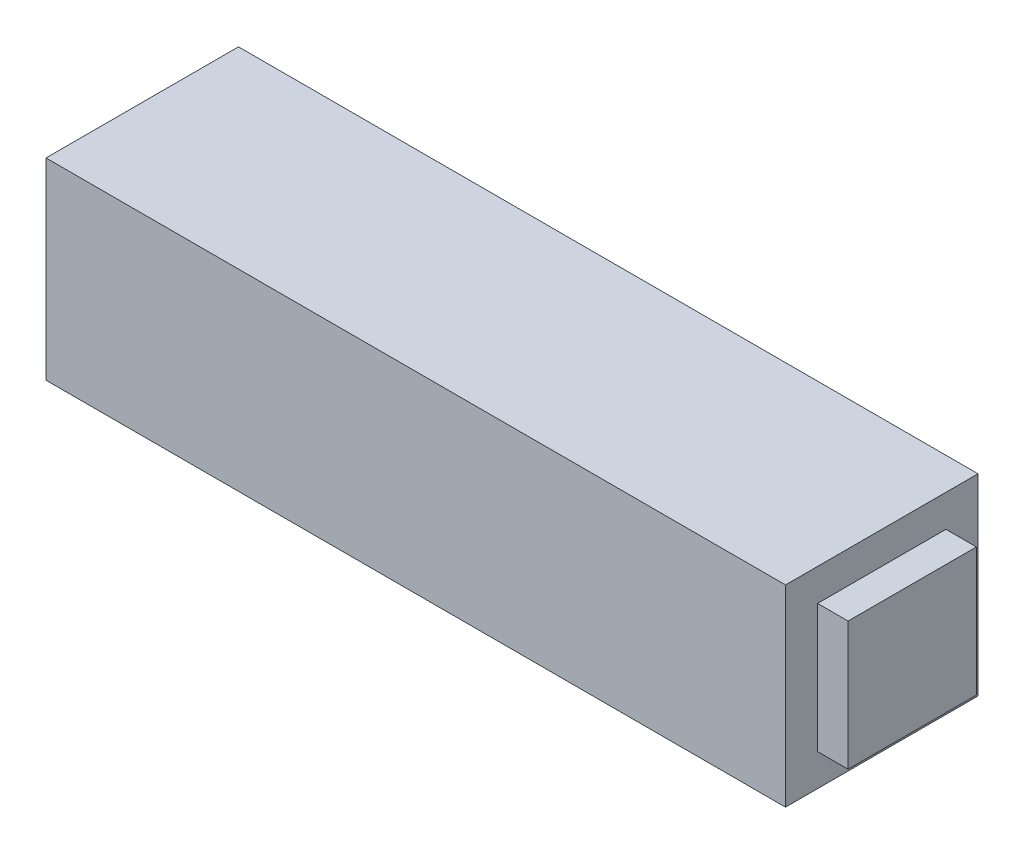
ISO-10303-21;
HEADER;
FILE_DESCRIPTION(('STEP AP214'),'2;1');
FILE_NAME('part.step','',(''),(''),'','','');
FILE_SCHEMA(('AUTOMOTIVE_DESIGN { 1 0 10303 214 1 1 1 1 }'));
ENDSEC;
DATA;
#1=APPLICATION_CONTEXT('core data for automotive mechanical design processes');
#2=APPLICATION_PROTOCOL_DEFINITION('international standard','automotive_design',2000,#1);
#3=PRODUCT_CONTEXT('',#1,'mechanical');
#4=PRODUCT('Part','Part','',(#3));
#5=PRODUCT_RELATED_PRODUCT_CATEGORY('part','',(#4));
#6=PRODUCT_DEFINITION_FORMATION('','',#4);
#7=PRODUCT_DEFINITION_CONTEXT('part definition',#1,'design');
#8=PRODUCT_DEFINITION('design','',#6,#7);
#9=PRODUCT_DEFINITION_SHAPE('','',#8);
#10=(LENGTH_UNIT() NAMED_UNIT(*) SI_UNIT(.MILLI.,.METRE.));
#11=(NAMED_UNIT(*) PLANE_ANGLE_UNIT() SI_UNIT($,.RADIAN.));
#12=(NAMED_UNIT(*) SI_UNIT($,.STERADIAN.) SOLID_ANGLE_UNIT());
#13=UNCERTAINTY_MEASURE_WITH_UNIT(LENGTH_MEASURE(1.E-05),#10,'distance_accuracy_value','');
#14=(GEOMETRIC_REPRESENTATION_CONTEXT(3) GLOBAL_UNCERTAINTY_ASSIGNED_CONTEXT((#13)) GLOBAL_UNIT_ASSIGNED_CONTEXT((#10,
#11,#12)) REPRESENTATION_CONTEXT('',''));
#15=CARTESIAN_POINT('',(0.,0.,0.));
#16=DIRECTION('',(0.,0.,1.));
#17=DIRECTION('',(1.,0.,0.));
#18=AXIS2_PLACEMENT_3D('',#15,#16,#17);
#19=CARTESIAN_POINT('',(57.625,-18.0775862068965,15.));
#20=DIRECTION('',(-1.,0.,0.));
#21=DIRECTION('',(0.,0.,1.));
#22=AXIS2_PLACEMENT_3D('',#19,#20,#21);
#23=PLANE('',#22);
#24=DIRECTION('',(0.,1.,0.));
#25=VECTOR('',#24,1.);
#26=CARTESIAN_POINT('',(57.625,-18.0775862068965,-15.));
#27=LINE('',#26,#25);
#28=CARTESIAN_POINT('',(57.625,-18.0775862068965,-15.));
#29=VERTEX_POINT('',#28);
#30=CARTESIAN_POINT('',(57.625,11.9224137931034,-15.));
#31=VERTEX_POINT('',#30);
#32=EDGE_CURVE('E203',#29,#31,#27,.T.);
#33=ORIENTED_EDGE('',*,*,#32,.T.);
#34=DIRECTION('',(0.,0.,-1.));
#35=VECTOR('',#34,1.);
#36=CARTESIAN_POINT('',(57.625,11.9224137931034,15.));
#37=LINE('',#36,#35);
#38=CARTESIAN_POINT('',(57.625,11.9224137931034,15.));
#39=VERTEX_POINT('',#38);
#40=EDGE_CURVE('E206',#39,#31,#37,.T.);
#41=ORIENTED_EDGE('',*,*,#40,.F.);
#42=DIRECTION('',(0.,1.,0.));
#43=VECTOR('',#42,1.);
#44=CARTESIAN_POINT('',(57.625,-18.0775862068965,15.));
#45=LINE('',#44,#43);
#46=CARTESIAN_POINT('',(57.625,-18.0775862068965,15.));
#47=VERTEX_POINT('',#46);
#48=EDGE_CURVE('E195',#47,#39,#45,.T.);
#49=ORIENTED_EDGE('',*,*,#48,.F.);
#50=DIRECTION('',(0.,0.,-1.));
#51=VECTOR('',#50,1.);
#52=CARTESIAN_POINT('',(57.625,-18.0775862068965,15.));
#53=LINE('',#52,#51);
#54=EDGE_CURVE('E50',#47,#29,#53,.T.);
#55=ORIENTED_EDGE('',*,*,#54,.T.);
#56=EDGE_LOOP('',(#33,#41,#49,#55));
#57=FACE_BOUND('',#56,.T.);
#58=DIRECTION('',(0.,-1.,0.));
#59=VECTOR('',#58,1.);
#60=CARTESIAN_POINT('',(57.625,-13.0775862068965,10.));
#61=LINE('',#60,#59);
#62=CARTESIAN_POINT('',(57.625,6.92241379310345,10.));
#63=VERTEX_POINT('',#62);
#64=CARTESIAN_POINT('',(57.625,-13.0775862068965,10.));
#65=VERTEX_POINT('',#64);
#66=EDGE_CURVE('E53',#63,#65,#61,.T.);
#67=ORIENTED_EDGE('',*,*,#66,.F.);
#68=DIRECTION('',(0.,0.,1.));
#69=VECTOR('',#68,1.);
#70=CARTESIAN_POINT('',(57.625,6.92241379310345,10.));
#71=LINE('',#70,#69);
#72=CARTESIAN_POINT('',(57.625,6.92241379310345,-10.));
#73=VERTEX_POINT('',#72);
#74=EDGE_CURVE('E59',#73,#63,#71,.T.);
#75=ORIENTED_EDGE('',*,*,#74,.F.);
#76=DIRECTION('',(0.,1.,0.));
#77=VECTOR('',#76,1.);
#78=CARTESIAN_POINT('',(57.625,-13.0775862068965,-10.));
#79=LINE('',#78,#77);
#80=CARTESIAN_POINT('',(57.625,-13.0775862068965,-10.));
#81=VERTEX_POINT('',#80);
#82=EDGE_CURVE('E373',#81,#73,#79,.T.);
#83=ORIENTED_EDGE('',*,*,#82,.F.);
#84=DIRECTION('',(0.,0.,-1.));
#85=VECTOR('',#84,1.);
#86=CARTESIAN_POINT('',(57.625,-13.0775862068965,10.));
#87=LINE('',#86,#85);
#88=EDGE_CURVE('E377',#65,#81,#87,.T.);
#89=ORIENTED_EDGE('',*,*,#88,.F.);
#90=EDGE_LOOP('',(#67,#75,#83,#89));
#91=FACE_BOUND('',#90,.T.);
#92=ADVANCED_FACE('F39',(#57,#91),#23,.F.);
#93=CARTESIAN_POINT('',(-57.625,-18.0775862068965,15.));
#94=DIRECTION('',(1.,0.,0.));
#95=DIRECTION('',(0.,0.,-1.));
#96=AXIS2_PLACEMENT_3D('',#93,#94,#95);
#97=PLANE('',#96);
#98=DIRECTION('',(0.,0.,1.));
#99=VECTOR('',#98,1.);
#100=CARTESIAN_POINT('',(-57.625,-13.5775862068966,-10.25));
#101=LINE('',#100,#99);
#102=CARTESIAN_POINT('',(-57.625,-13.5775862068966,-10.25));
#103=VERTEX_POINT('',#102);
#104=CARTESIAN_POINT('',(-57.625,-13.5775862068966,10.25));
#105=VERTEX_POINT('',#104);
#106=EDGE_CURVE('E147',#103,#105,#101,.T.);
#107=ORIENTED_EDGE('',*,*,#106,.F.);
#108=DIRECTION('',(0.,-1.,0.));
#109=VECTOR('',#108,1.);
#110=CARTESIAN_POINT('',(-57.625,-13.5775862068966,-10.25));
#111=LINE('',#110,#109);
#112=CARTESIAN_POINT('',(-57.625,6.92241379310345,-10.25));
#113=VERTEX_POINT('',#112);
#114=EDGE_CURVE('E146',#113,#103,#111,.T.);
#115=ORIENTED_EDGE('',*,*,#114,.F.);
#116=DIRECTION('',(0.,0.,-1.));
#117=VECTOR('',#116,1.);
#118=CARTESIAN_POINT('',(-57.625,6.92241379310345,-10.25));
#119=LINE('',#118,#117);
#120=CARTESIAN_POINT('',(-57.625,6.92241379310345,10.25));
#121=VERTEX_POINT('',#120);
#122=EDGE_CURVE('E159',#121,#113,#119,.T.);
#123=ORIENTED_EDGE('',*,*,#122,.F.);
#124=DIRECTION('',(0.,1.,0.));
#125=VECTOR('',#124,1.);
#126=CARTESIAN_POINT('',(-57.625,-13.5775862068966,10.25));
#127=LINE('',#126,#125);
#128=EDGE_CURVE('E174',#105,#121,#127,.T.);
#129=ORIENTED_EDGE('',*,*,#128,.F.);
#130=EDGE_LOOP('',(#107,#115,#123,#129));
#131=FACE_BOUND('',#130,.T.);
#132=DIRECTION('',(0.,-1.,0.));
#133=VECTOR('',#132,1.);
#134=CARTESIAN_POINT('',(-57.625,-18.0775862068965,-15.));
#135=LINE('',#134,#133);
#136=CARTESIAN_POINT('',(-57.625,11.9224137931034,-15.));
#137=VERTEX_POINT('',#136);
#138=CARTESIAN_POINT('',(-57.625,-18.0775862068965,-15.));
#139=VERTEX_POINT('',#138);
#140=EDGE_CURVE('E179',#137,#139,#135,.T.);
#141=ORIENTED_EDGE('',*,*,#140,.T.);
#142=DIRECTION('',(0.,0.,-1.));
#143=VECTOR('',#142,1.);
#144=CARTESIAN_POINT('',(-57.625,-18.0775862068965,15.));
#145=LINE('',#144,#143);
#146=CARTESIAN_POINT('',(-57.625,-18.0775862068965,15.));
#147=VERTEX_POINT('',#146);
#148=EDGE_CURVE('E11',#147,#139,#145,.T.);
#149=ORIENTED_EDGE('',*,*,#148,.F.);
#150=DIRECTION('',(0.,-1.,0.));
#151=VECTOR('',#150,1.);
#152=CARTESIAN_POINT('',(-57.625,-18.0775862068965,15.));
#153=LINE('',#152,#151);
#154=CARTESIAN_POINT('',(-57.625,11.9224137931034,15.));
#155=VERTEX_POINT('',#154);
#156=EDGE_CURVE('E188',#155,#147,#153,.T.);
#157=ORIENTED_EDGE('',*,*,#156,.F.);
#158=DIRECTION('',(0.,0.,-1.));
#159=VECTOR('',#158,1.);
#160=CARTESIAN_POINT('',(-57.625,11.9224137931034,15.));
#161=LINE('',#160,#159);
#162=EDGE_CURVE('E198',#155,#137,#161,.T.);
#163=ORIENTED_EDGE('',*,*,#162,.T.);
#164=EDGE_LOOP('',(#141,#149,#157,#163));
#165=FACE_BOUND('',#164,.T.);
#166=ADVANCED_FACE('F41',(#131,#165),#97,.F.);
#167=CARTESIAN_POINT('',(-57.625,-18.0775862068965,15.));
#168=DIRECTION('',(0.,1.,0.));
#169=DIRECTION('',(0.,0.,1.));
#170=AXIS2_PLACEMENT_3D('',#167,#168,#169);
#171=PLANE('',#170);
#172=DIRECTION('',(1.,0.,0.));
#173=VECTOR('',#172,1.);
#174=CARTESIAN_POINT('',(-57.625,-18.0775862068965,-15.));
#175=LINE('',#174,#173);
#176=EDGE_CURVE('E200',#139,#29,#175,.T.);
#177=ORIENTED_EDGE('',*,*,#176,.T.);
#178=ORIENTED_EDGE('',*,*,#54,.F.);
#179=DIRECTION('',(1.,0.,0.));
#180=VECTOR('',#179,1.);
#181=CARTESIAN_POINT('',(-57.625,-18.0775862068965,15.));
#182=LINE('',#181,#180);
#183=EDGE_CURVE('E190',#147,#47,#182,.T.);
#184=ORIENTED_EDGE('',*,*,#183,.F.);
#185=ORIENTED_EDGE('',*,*,#148,.T.);
#186=EDGE_LOOP('',(#177,#178,#184,#185));
#187=FACE_BOUND('',#186,.T.);
#188=ADVANCED_FACE('F227',(#187),#171,.F.);
#189=CARTESIAN_POINT('',(-57.625,11.9224137931034,15.));
#190=DIRECTION('',(0.,-1.,0.));
#191=DIRECTION('',(0.,0.,-1.));
#192=AXIS2_PLACEMENT_3D('',#189,#190,#191);
#193=PLANE('',#192);
#194=DIRECTION('',(-1.,0.,0.));
#195=VECTOR('',#194,1.);
#196=CARTESIAN_POINT('',(-57.625,11.9224137931034,-15.));
#197=LINE('',#196,#195);
#198=EDGE_CURVE('E186',#31,#137,#197,.T.);
#199=ORIENTED_EDGE('',*,*,#198,.T.);
#200=ORIENTED_EDGE('',*,*,#162,.F.);
#201=DIRECTION('',(-1.,0.,0.));
#202=VECTOR('',#201,1.);
#203=CARTESIAN_POINT('',(-57.625,11.9224137931034,15.));
#204=LINE('',#203,#202);
#205=EDGE_CURVE('E194',#39,#155,#204,.T.);
#206=ORIENTED_EDGE('',*,*,#205,.F.);
#207=ORIENTED_EDGE('',*,*,#40,.T.);
#208=EDGE_LOOP('',(#199,#200,#206,#207));
#209=FACE_BOUND('',#208,.T.);
#210=ADVANCED_FACE('F222',(#209),#193,.F.);
#211=CARTESIAN_POINT('',(0.,0.,15.));
#212=DIRECTION('',(0.,0.,-1.));
#213=DIRECTION('',(-1.,0.,0.));
#214=AXIS2_PLACEMENT_3D('',#211,#212,#213);
#215=PLANE('',#214);
#216=ORIENTED_EDGE('',*,*,#156,.T.);
#217=ORIENTED_EDGE('',*,*,#183,.T.);
#218=ORIENTED_EDGE('',*,*,#48,.T.);
#219=ORIENTED_EDGE('',*,*,#205,.T.);
#220=EDGE_LOOP('',(#216,#217,#218,#219));
#221=FACE_BOUND('',#220,.T.);
#222=ADVANCED_FACE('F229',(#221),#215,.F.);
#223=CARTESIAN_POINT('',(0.,0.,-15.));
#224=DIRECTION('',(0.,0.,-1.));
#225=DIRECTION('',(-1.,0.,0.));
#226=AXIS2_PLACEMENT_3D('',#223,#224,#225);
#227=PLANE('',#226);
#228=ORIENTED_EDGE('',*,*,#140,.F.);
#229=ORIENTED_EDGE('',*,*,#198,.F.);
#230=ORIENTED_EDGE('',*,*,#32,.F.);
#231=ORIENTED_EDGE('',*,*,#176,.F.);
#232=EDGE_LOOP('',(#228,#229,#230,#231));
#233=FACE_BOUND('',#232,.T.);
#234=ADVANCED_FACE('F217',(#233),#227,.T.);
#235=CARTESIAN_POINT('',(-47.625,-13.5775862068966,-10.25));
#236=DIRECTION('',(0.,0.,-1.));
#237=DIRECTION('',(-1.,0.,0.));
#238=AXIS2_PLACEMENT_3D('',#235,#236,#237);
#239=PLANE('',#238);
#240=ORIENTED_EDGE('',*,*,#114,.T.);
#241=DIRECTION('',(-1.,0.,0.));
#242=VECTOR('',#241,1.);
#243=CARTESIAN_POINT('',(-47.625,-13.5775862068966,-10.25));
#244=LINE('',#243,#242);
#245=CARTESIAN_POINT('',(-47.625,-13.5775862068966,-10.25));
#246=VERTEX_POINT('',#245);
#247=EDGE_CURVE('E169',#246,#103,#244,.T.);
#248=ORIENTED_EDGE('',*,*,#247,.F.);
#249=DIRECTION('',(0.,-1.,0.));
#250=VECTOR('',#249,1.);
#251=CARTESIAN_POINT('',(-47.625,-13.5775862068966,-10.25));
#252=LINE('',#251,#250);
#253=CARTESIAN_POINT('',(-47.625,6.92241379310345,-10.25));
#254=VERTEX_POINT('',#253);
#255=EDGE_CURVE('E156',#254,#246,#252,.T.);
#256=ORIENTED_EDGE('',*,*,#255,.F.);
#257=DIRECTION('',(-1.,0.,0.));
#258=VECTOR('',#257,1.);
#259=CARTESIAN_POINT('',(-47.625,6.92241379310345,-10.25));
#260=LINE('',#259,#258);
#261=EDGE_CURVE('E180',#254,#113,#260,.T.);
#262=ORIENTED_EDGE('',*,*,#261,.T.);
#263=EDGE_LOOP('',(#240,#248,#256,#262));
#264=FACE_BOUND('',#263,.T.);
#265=ADVANCED_FACE('F241',(#264),#239,.F.);
#266=CARTESIAN_POINT('',(-47.625,6.92241379310345,-10.25));
#267=DIRECTION('',(0.,1.,0.));
#268=DIRECTION('',(0.,0.,1.));
#269=AXIS2_PLACEMENT_3D('',#266,#267,#268);
#270=PLANE('',#269);
#271=ORIENTED_EDGE('',*,*,#122,.T.);
#272=ORIENTED_EDGE('',*,*,#261,.F.);
#273=DIRECTION('',(0.,0.,-1.));
#274=VECTOR('',#273,1.);
#275=CARTESIAN_POINT('',(-47.625,6.92241379310345,-10.25));
#276=LINE('',#275,#274);
#277=CARTESIAN_POINT('',(-47.625,6.92241379310345,10.25));
#278=VERTEX_POINT('',#277);
#279=EDGE_CURVE('E167',#278,#254,#276,.T.);
#280=ORIENTED_EDGE('',*,*,#279,.F.);
#281=DIRECTION('',(-1.,0.,0.));
#282=VECTOR('',#281,1.);
#283=CARTESIAN_POINT('',(-47.625,6.92241379310345,10.25));
#284=LINE('',#283,#282);
#285=EDGE_CURVE('E176',#278,#121,#284,.T.);
#286=ORIENTED_EDGE('',*,*,#285,.T.);
#287=EDGE_LOOP('',(#271,#272,#280,#286));
#288=FACE_BOUND('',#287,.T.);
#289=ADVANCED_FACE('F246',(#288),#270,.F.);
#290=CARTESIAN_POINT('',(-47.625,-13.5775862068966,10.25));
#291=DIRECTION('',(0.,0.,1.));
#292=DIRECTION('',(1.,0.,0.));
#293=AXIS2_PLACEMENT_3D('',#290,#291,#292);
#294=PLANE('',#293);
#295=ORIENTED_EDGE('',*,*,#128,.T.);
#296=ORIENTED_EDGE('',*,*,#285,.F.);
#297=DIRECTION('',(0.,1.,0.));
#298=VECTOR('',#297,1.);
#299=CARTESIAN_POINT('',(-47.625,-13.5775862068966,10.25));
#300=LINE('',#299,#298);
#301=CARTESIAN_POINT('',(-47.625,-13.5775862068966,10.25));
#302=VERTEX_POINT('',#301);
#303=EDGE_CURVE('E162',#302,#278,#300,.T.);
#304=ORIENTED_EDGE('',*,*,#303,.F.);
#305=DIRECTION('',(-1.,0.,0.));
#306=VECTOR('',#305,1.);
#307=CARTESIAN_POINT('',(-47.625,-13.5775862068966,10.25));
#308=LINE('',#307,#306);
#309=EDGE_CURVE('E185',#302,#105,#308,.T.);
#310=ORIENTED_EDGE('',*,*,#309,.T.);
#311=EDGE_LOOP('',(#295,#296,#304,#310));
#312=FACE_BOUND('',#311,.T.);
#313=ADVANCED_FACE('F258',(#312),#294,.F.);
#314=CARTESIAN_POINT('',(-47.625,-13.5775862068966,-10.25));
#315=DIRECTION('',(0.,-1.,0.));
#316=DIRECTION('',(0.,0.,-1.));
#317=AXIS2_PLACEMENT_3D('',#314,#315,#316);
#318=PLANE('',#317);
#319=ORIENTED_EDGE('',*,*,#106,.T.);
#320=ORIENTED_EDGE('',*,*,#309,.F.);
#321=DIRECTION('',(0.,0.,1.));
#322=VECTOR('',#321,1.);
#323=CARTESIAN_POINT('',(-47.625,-13.5775862068966,-10.25));
#324=LINE('',#323,#322);
#325=EDGE_CURVE('E157',#246,#302,#324,.T.);
#326=ORIENTED_EDGE('',*,*,#325,.F.);
#327=ORIENTED_EDGE('',*,*,#247,.T.);
#328=EDGE_LOOP('',(#319,#320,#326,#327));
#329=FACE_BOUND('',#328,.T.);
#330=ADVANCED_FACE('F252',(#329),#318,.F.);
#331=CARTESIAN_POINT('',(-47.625,0.,0.));
#332=DIRECTION('',(1.,0.,0.));
#333=DIRECTION('',(0.,0.,-1.));
#334=AXIS2_PLACEMENT_3D('',#331,#332,#333);
#335=PLANE('',#334);
#336=ORIENTED_EDGE('',*,*,#255,.T.);
#337=ORIENTED_EDGE('',*,*,#325,.T.);
#338=ORIENTED_EDGE('',*,*,#303,.T.);
#339=ORIENTED_EDGE('',*,*,#279,.T.);
#340=EDGE_LOOP('',(#336,#337,#338,#339));
#341=FACE_BOUND('',#340,.T.);
#342=ADVANCED_FACE('F254',(#341),#335,.F.);
#343=CARTESIAN_POINT('',(62.375,-13.0775862068965,10.));
#344=DIRECTION('',(0.,0.,-1.));
#345=DIRECTION('',(-1.,0.,0.));
#346=AXIS2_PLACEMENT_3D('',#343,#344,#345);
#347=PLANE('',#346);
#348=ORIENTED_EDGE('',*,*,#66,.T.);
#349=DIRECTION('',(-1.,0.,0.));
#350=VECTOR('',#349,1.);
#351=CARTESIAN_POINT('',(62.375,-13.0775862068965,10.));
#352=LINE('',#351,#350);
#353=CARTESIAN_POINT('',(62.375,-13.0775862068965,10.));
#354=VERTEX_POINT('',#353);
#355=EDGE_CURVE('E133',#354,#65,#352,.T.);
#356=ORIENTED_EDGE('',*,*,#355,.F.);
#357=DIRECTION('',(0.,-1.,0.));
#358=VECTOR('',#357,1.);
#359=CARTESIAN_POINT('',(62.375,-13.0775862068965,10.));
#360=LINE('',#359,#358);
#361=CARTESIAN_POINT('',(62.375,6.92241379310345,10.));
#362=VERTEX_POINT('',#361);
#363=EDGE_CURVE('E140',#362,#354,#360,.T.);
#364=ORIENTED_EDGE('',*,*,#363,.F.);
#365=DIRECTION('',(-1.,0.,0.));
#366=VECTOR('',#365,1.);
#367=CARTESIAN_POINT('',(62.375,6.92241379310345,10.));
#368=LINE('',#367,#366);
#369=EDGE_CURVE('E371',#362,#63,#368,.T.);
#370=ORIENTED_EDGE('',*,*,#369,.T.);
#371=EDGE_LOOP('',(#348,#356,#364,#370));
#372=FACE_BOUND('',#371,.T.);
#373=ADVANCED_FACE('F150',(#372),#347,.F.);
#374=CARTESIAN_POINT('',(62.375,-13.0775862068965,10.));
#375=DIRECTION('',(0.,1.,0.));
#376=DIRECTION('',(0.,0.,1.));
#377=AXIS2_PLACEMENT_3D('',#374,#375,#376);
#378=PLANE('',#377);
#379=ORIENTED_EDGE('',*,*,#88,.T.);
#380=DIRECTION('',(-1.,0.,0.));
#381=VECTOR('',#380,1.);
#382=CARTESIAN_POINT('',(62.375,-13.0775862068965,-10.));
#383=LINE('',#382,#381);
#384=CARTESIAN_POINT('',(62.375,-13.0775862068965,-10.));
#385=VERTEX_POINT('',#384);
#386=EDGE_CURVE('E132',#385,#81,#383,.T.);
#387=ORIENTED_EDGE('',*,*,#386,.F.);
#388=DIRECTION('',(0.,0.,-1.));
#389=VECTOR('',#388,1.);
#390=CARTESIAN_POINT('',(62.375,-13.0775862068965,10.));
#391=LINE('',#390,#389);
#392=EDGE_CURVE('E127',#354,#385,#391,.T.);
#393=ORIENTED_EDGE('',*,*,#392,.F.);
#394=ORIENTED_EDGE('',*,*,#355,.T.);
#395=EDGE_LOOP('',(#379,#387,#393,#394));
#396=FACE_BOUND('',#395,.T.);
#397=ADVANCED_FACE('F129',(#396),#378,.F.);
#398=CARTESIAN_POINT('',(62.375,-13.0775862068965,-10.));
#399=DIRECTION('',(0.,0.,1.));
#400=DIRECTION('',(1.,0.,0.));
#401=AXIS2_PLACEMENT_3D('',#398,#399,#400);
#402=PLANE('',#401);
#403=ORIENTED_EDGE('',*,*,#82,.T.);
#404=DIRECTION('',(-1.,0.,0.));
#405=VECTOR('',#404,1.);
#406=CARTESIAN_POINT('',(62.375,6.92241379310345,-10.));
#407=LINE('',#406,#405);
#408=CARTESIAN_POINT('',(62.375,6.92241379310345,-10.));
#409=VERTEX_POINT('',#408);
#410=EDGE_CURVE('E155',#409,#73,#407,.T.);
#411=ORIENTED_EDGE('',*,*,#410,.F.);
#412=DIRECTION('',(0.,1.,0.));
#413=VECTOR('',#412,1.);
#414=CARTESIAN_POINT('',(62.375,-13.0775862068965,-10.));
#415=LINE('',#414,#413);
#416=EDGE_CURVE('E137',#385,#409,#415,.T.);
#417=ORIENTED_EDGE('',*,*,#416,.F.);
#418=ORIENTED_EDGE('',*,*,#386,.T.);
#419=EDGE_LOOP('',(#403,#411,#417,#418));
#420=FACE_BOUND('',#419,.T.);
#421=ADVANCED_FACE('F267',(#420),#402,.F.);
#422=CARTESIAN_POINT('',(62.375,6.92241379310345,10.));
#423=DIRECTION('',(0.,-1.,0.));
#424=DIRECTION('',(0.,0.,-1.));
#425=AXIS2_PLACEMENT_3D('',#422,#423,#424);
#426=PLANE('',#425);
#427=ORIENTED_EDGE('',*,*,#74,.T.);
#428=ORIENTED_EDGE('',*,*,#369,.F.);
#429=DIRECTION('',(0.,0.,1.));
#430=VECTOR('',#429,1.);
#431=CARTESIAN_POINT('',(62.375,6.92241379310345,10.));
#432=LINE('',#431,#430);
#433=EDGE_CURVE('E142',#409,#362,#432,.T.);
#434=ORIENTED_EDGE('',*,*,#433,.F.);
#435=ORIENTED_EDGE('',*,*,#410,.T.);
#436=EDGE_LOOP('',(#427,#428,#434,#435));
#437=FACE_BOUND('',#436,.T.);
#438=ADVANCED_FACE('F275',(#437),#426,.F.);
#439=CARTESIAN_POINT('',(62.375,0.,0.));
#440=DIRECTION('',(-1.,0.,0.));
#441=DIRECTION('',(0.,0.,1.));
#442=AXIS2_PLACEMENT_3D('',#439,#440,#441);
#443=PLANE('',#442);
#444=ORIENTED_EDGE('',*,*,#363,.T.);
#445=ORIENTED_EDGE('',*,*,#392,.T.);
#446=ORIENTED_EDGE('',*,*,#416,.T.);
#447=ORIENTED_EDGE('',*,*,#433,.T.);
#448=EDGE_LOOP('',(#444,#445,#446,#447));
#449=FACE_BOUND('',#448,.T.);
#450=ADVANCED_FACE('F136',(#449),#443,.F.);
#451=CLOSED_SHELL('',(#92,#166,#188,#210,#222,#234,#265,#289,#313,#330,#342,#373,#397,#421,#438,#450));
#452=MANIFOLD_SOLID_BREP('B2',#451);
#453=ADVANCED_BREP_SHAPE_REPRESENTATION('',(#18,#452),#14);
#454=SHAPE_DEFINITION_REPRESENTATION(#9,#453);
ENDSEC;
END-ISO-10303-21;
